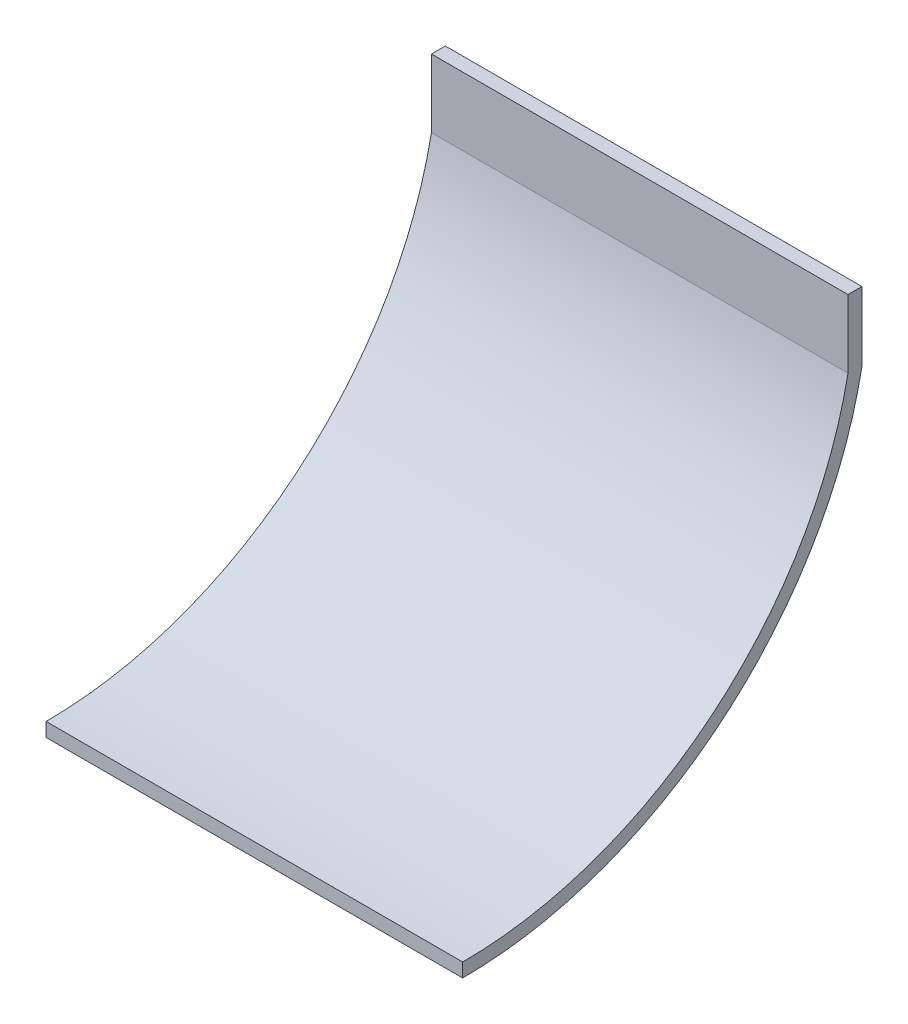
ISO-10303-21;
HEADER;
FILE_DESCRIPTION(('STEP AP214'),'2;1');
FILE_NAME('part.step','',(''),(''),'','','');
FILE_SCHEMA(('AUTOMOTIVE_DESIGN { 1 0 10303 214 1 1 1 1 }'));
ENDSEC;
DATA;
#1=APPLICATION_CONTEXT('core data for automotive mechanical design processes');
#2=APPLICATION_PROTOCOL_DEFINITION('international standard','automotive_design',2000,#1);
#3=PRODUCT_CONTEXT('',#1,'mechanical');
#4=PRODUCT('Part','Part','',(#3));
#5=PRODUCT_RELATED_PRODUCT_CATEGORY('part','',(#4));
#6=PRODUCT_DEFINITION_FORMATION('','',#4);
#7=PRODUCT_DEFINITION_CONTEXT('part definition',#1,'design');
#8=PRODUCT_DEFINITION('design','',#6,#7);
#9=PRODUCT_DEFINITION_SHAPE('','',#8);
#10=(LENGTH_UNIT() NAMED_UNIT(*) SI_UNIT(.MILLI.,.METRE.));
#11=(NAMED_UNIT(*) PLANE_ANGLE_UNIT() SI_UNIT($,.RADIAN.));
#12=(NAMED_UNIT(*) SI_UNIT($,.STERADIAN.) SOLID_ANGLE_UNIT());
#13=UNCERTAINTY_MEASURE_WITH_UNIT(LENGTH_MEASURE(1.E-05),#10,'distance_accuracy_value','');
#14=(GEOMETRIC_REPRESENTATION_CONTEXT(3) GLOBAL_UNCERTAINTY_ASSIGNED_CONTEXT((#13)) GLOBAL_UNIT_ASSIGNED_CONTEXT((#10,
#11,#12)) REPRESENTATION_CONTEXT('',''));
#15=CARTESIAN_POINT('',(0.,0.,0.));
#16=DIRECTION('',(0.,0.,1.));
#17=DIRECTION('',(1.,0.,0.));
#18=AXIS2_PLACEMENT_3D('',#15,#16,#17);
#19=CARTESIAN_POINT('',(-38.1,45.786842105263,38.0999999999998));
#20=DIRECTION('',(1.,0.,0.));
#21=DIRECTION('',(0.,0.,-1.));
#22=AXIS2_PLACEMENT_3D('',#19,#20,#21);
#23=CYLINDRICAL_SURFACE('',#22,74.361842105263);
#24=DIRECTION('',(1.,0.,0.));
#25=VECTOR('',#24,1.);
#26=CARTESIAN_POINT('',(-38.1,31.75,-34.925));
#27=LINE('',#26,#25);
#28=CARTESIAN_POINT('',(-38.1,31.75,-34.925));
#29=VERTEX_POINT('',#28);
#30=CARTESIAN_POINT('',(38.1,31.75,-34.925));
#31=VERTEX_POINT('',#30);
#32=EDGE_CURVE('E42',#29,#31,#27,.T.);
#33=ORIENTED_EDGE('',*,*,#32,.T.);
#34=CARTESIAN_POINT('',(38.1,45.786842105263,38.0999999999998));
#35=DIRECTION('',(1.,0.,0.));
#36=DIRECTION('',(0.,0.,-1.));
#37=AXIS2_PLACEMENT_3D('',#34,#35,#36);
#38=CIRCLE('',#37,74.361842105263);
#39=CARTESIAN_POINT('',(38.1,-28.575,38.1));
#40=VERTEX_POINT('',#39);
#41=EDGE_CURVE('E92',#40,#31,#38,.T.);
#42=ORIENTED_EDGE('',*,*,#41,.F.);
#43=DIRECTION('',(1.,0.,0.));
#44=VECTOR('',#43,1.);
#45=CARTESIAN_POINT('',(-38.1,-28.575,38.1));
#46=LINE('',#45,#44);
#47=CARTESIAN_POINT('',(-38.1,-28.575,38.1));
#48=VERTEX_POINT('',#47);
#49=EDGE_CURVE('E11',#48,#40,#46,.T.);
#50=ORIENTED_EDGE('',*,*,#49,.F.);
#51=CARTESIAN_POINT('',(-38.1,45.786842105263,38.0999999999998));
#52=DIRECTION('',(1.,0.,0.));
#53=DIRECTION('',(0.,0.,-1.));
#54=AXIS2_PLACEMENT_3D('',#51,#52,#53);
#55=CIRCLE('',#54,74.361842105263);
#56=EDGE_CURVE('E93',#48,#29,#55,.T.);
#57=ORIENTED_EDGE('',*,*,#56,.T.);
#58=EDGE_LOOP('',(#33,#42,#50,#57));
#59=FACE_BOUND('',#58,.T.);
#60=ADVANCED_FACE('F39',(#59),#23,.T.);
#61=CARTESIAN_POINT('',(-38.1,-26.035,38.1));
#62=DIRECTION('',(0.,0.,1.));
#63=DIRECTION('',(1.,0.,0.));
#64=AXIS2_PLACEMENT_3D('',#61,#62,#63);
#65=PLANE('',#64);
#66=ORIENTED_EDGE('',*,*,#49,.T.);
#67=DIRECTION('',(0.,-1.,0.));
#68=VECTOR('',#67,1.);
#69=CARTESIAN_POINT('',(38.1,-26.035,38.1));
#70=LINE('',#69,#68);
#71=CARTESIAN_POINT('',(38.1,-26.035,38.1));
#72=VERTEX_POINT('',#71);
#73=EDGE_CURVE('E112',#72,#40,#70,.T.);
#74=ORIENTED_EDGE('',*,*,#73,.F.);
#75=DIRECTION('',(1.,0.,0.));
#76=VECTOR('',#75,1.);
#77=CARTESIAN_POINT('',(-38.1,-26.035,38.1));
#78=LINE('',#77,#76);
#79=CARTESIAN_POINT('',(-38.1,-26.035,38.1));
#80=VERTEX_POINT('',#79);
#81=EDGE_CURVE('E48',#80,#72,#78,.T.);
#82=ORIENTED_EDGE('',*,*,#81,.F.);
#83=DIRECTION('',(0.,-1.,0.));
#84=VECTOR('',#83,1.);
#85=CARTESIAN_POINT('',(-38.1,-26.035,38.1));
#86=LINE('',#85,#84);
#87=EDGE_CURVE('E99',#80,#48,#86,.T.);
#88=ORIENTED_EDGE('',*,*,#87,.T.);
#89=EDGE_LOOP('',(#66,#74,#82,#88));
#90=FACE_BOUND('',#89,.T.);
#91=ADVANCED_FACE('F167',(#90),#65,.T.);
#92=CARTESIAN_POINT('',(-38.1,45.786842105263,38.0999999999998));
#93=DIRECTION('',(1.,0.,0.));
#94=DIRECTION('',(0.,0.,-1.));
#95=AXIS2_PLACEMENT_3D('',#92,#93,#94);
#96=CYLINDRICAL_SURFACE('',#95,71.821842105263);
#97=ORIENTED_EDGE('',*,*,#81,.T.);
#98=CARTESIAN_POINT('',(38.1,45.786842105263,38.0999999999998));
#99=DIRECTION('',(-1.,0.,0.));
#100=DIRECTION('',(0.,0.,-1.));
#101=AXIS2_PLACEMENT_3D('',#98,#99,#100);
#102=CIRCLE('',#101,71.821842105263);
#103=CARTESIAN_POINT('',(38.1,31.9940259173575,-32.385));
#104=VERTEX_POINT('',#103);
#105=EDGE_CURVE('E122',#104,#72,#102,.T.);
#106=ORIENTED_EDGE('',*,*,#105,.F.);
#107=DIRECTION('',(1.,0.,0.));
#108=VECTOR('',#107,1.);
#109=CARTESIAN_POINT('',(-38.1,31.9940259173575,-32.385));
#110=LINE('',#109,#108);
#111=CARTESIAN_POINT('',(-38.1,31.9940259173575,-32.385));
#112=VERTEX_POINT('',#111);
#113=EDGE_CURVE('E147',#112,#104,#110,.T.);
#114=ORIENTED_EDGE('',*,*,#113,.F.);
#115=CARTESIAN_POINT('',(-38.1,45.786842105263,38.0999999999998));
#116=DIRECTION('',(-1.,0.,0.));
#117=DIRECTION('',(0.,0.,-1.));
#118=AXIS2_PLACEMENT_3D('',#115,#116,#117);
#119=CIRCLE('',#118,71.821842105263);
#120=EDGE_CURVE('E140',#112,#80,#119,.T.);
#121=ORIENTED_EDGE('',*,*,#120,.T.);
#122=EDGE_LOOP('',(#97,#106,#114,#121));
#123=FACE_BOUND('',#122,.T.);
#124=ADVANCED_FACE('F163',(#123),#96,.F.);
#125=CARTESIAN_POINT('',(-38.1,31.9940259173575,-32.385));
#126=DIRECTION('',(0.,0.,1.));
#127=DIRECTION('',(1.,0.,0.));
#128=AXIS2_PLACEMENT_3D('',#125,#126,#127);
#129=PLANE('',#128);
#130=ORIENTED_EDGE('',*,*,#113,.T.);
#131=DIRECTION('',(0.,-1.,0.));
#132=VECTOR('',#131,1.);
#133=CARTESIAN_POINT('',(38.1,31.9940259173575,-32.385));
#134=LINE('',#133,#132);
#135=CARTESIAN_POINT('',(38.1,44.45,-32.385));
#136=VERTEX_POINT('',#135);
#137=EDGE_CURVE('E118',#136,#104,#134,.T.);
#138=ORIENTED_EDGE('',*,*,#137,.F.);
#139=DIRECTION('',(1.,0.,0.));
#140=VECTOR('',#139,1.);
#141=CARTESIAN_POINT('',(-38.1,44.45,-32.385));
#142=LINE('',#141,#140);
#143=CARTESIAN_POINT('',(-38.1,44.45,-32.385));
#144=VERTEX_POINT('',#143);
#145=EDGE_CURVE('E150',#144,#136,#142,.T.);
#146=ORIENTED_EDGE('',*,*,#145,.F.);
#147=DIRECTION('',(0.,-1.,0.));
#148=VECTOR('',#147,1.);
#149=CARTESIAN_POINT('',(-38.1,31.9940259173575,-32.385));
#150=LINE('',#149,#148);
#151=EDGE_CURVE('E136',#144,#112,#150,.T.);
#152=ORIENTED_EDGE('',*,*,#151,.T.);
#153=EDGE_LOOP('',(#130,#138,#146,#152));
#154=FACE_BOUND('',#153,.T.);
#155=ADVANCED_FACE('F160',(#154),#129,.T.);
#156=CARTESIAN_POINT('',(-38.1,44.45,-34.925));
#157=DIRECTION('',(0.,1.,0.));
#158=DIRECTION('',(0.,0.,1.));
#159=AXIS2_PLACEMENT_3D('',#156,#157,#158);
#160=PLANE('',#159);
#161=ORIENTED_EDGE('',*,*,#145,.T.);
#162=DIRECTION('',(0.,0.,1.));
#163=VECTOR('',#162,1.);
#164=CARTESIAN_POINT('',(38.1,44.45,-34.925));
#165=LINE('',#164,#163);
#166=CARTESIAN_POINT('',(38.1,44.45,-34.925));
#167=VERTEX_POINT('',#166);
#168=EDGE_CURVE('E107',#167,#136,#165,.T.);
#169=ORIENTED_EDGE('',*,*,#168,.F.);
#170=DIRECTION('',(1.,0.,0.));
#171=VECTOR('',#170,1.);
#172=CARTESIAN_POINT('',(-38.1,44.45,-34.925));
#173=LINE('',#172,#171);
#174=CARTESIAN_POINT('',(-38.1,44.45,-34.925));
#175=VERTEX_POINT('',#174);
#176=EDGE_CURVE('E98',#175,#167,#173,.T.);
#177=ORIENTED_EDGE('',*,*,#176,.F.);
#178=DIRECTION('',(0.,0.,1.));
#179=VECTOR('',#178,1.);
#180=CARTESIAN_POINT('',(-38.1,44.45,-34.925));
#181=LINE('',#180,#179);
#182=EDGE_CURVE('E132',#175,#144,#181,.T.);
#183=ORIENTED_EDGE('',*,*,#182,.T.);
#184=EDGE_LOOP('',(#161,#169,#177,#183));
#185=FACE_BOUND('',#184,.T.);
#186=ADVANCED_FACE('F154',(#185),#160,.T.);
#187=CARTESIAN_POINT('',(-38.1,31.75,-34.925));
#188=DIRECTION('',(0.,0.,-1.));
#189=DIRECTION('',(-1.,0.,0.));
#190=AXIS2_PLACEMENT_3D('',#187,#188,#189);
#191=PLANE('',#190);
#192=ORIENTED_EDGE('',*,*,#176,.T.);
#193=DIRECTION('',(0.,1.,0.));
#194=VECTOR('',#193,1.);
#195=CARTESIAN_POINT('',(38.1,31.75,-34.925));
#196=LINE('',#195,#194);
#197=EDGE_CURVE('E101',#31,#167,#196,.T.);
#198=ORIENTED_EDGE('',*,*,#197,.F.);
#199=ORIENTED_EDGE('',*,*,#32,.F.);
#200=DIRECTION('',(0.,1.,0.));
#201=VECTOR('',#200,1.);
#202=CARTESIAN_POINT('',(-38.1,31.75,-34.925));
#203=LINE('',#202,#201);
#204=EDGE_CURVE('E129',#29,#175,#203,.T.);
#205=ORIENTED_EDGE('',*,*,#204,.T.);
#206=EDGE_LOOP('',(#192,#198,#199,#205));
#207=FACE_BOUND('',#206,.T.);
#208=ADVANCED_FACE('F102',(#207),#191,.T.);
#209=CARTESIAN_POINT('',(-38.1,45.786842105263,38.0999999999998));
#210=DIRECTION('',(1.,0.,0.));
#211=DIRECTION('',(0.,0.,-1.));
#212=AXIS2_PLACEMENT_3D('',#209,#210,#211);
#213=PLANE('',#212);
#214=ORIENTED_EDGE('',*,*,#56,.F.);
#215=ORIENTED_EDGE('',*,*,#87,.F.);
#216=ORIENTED_EDGE('',*,*,#120,.F.);
#217=ORIENTED_EDGE('',*,*,#151,.F.);
#218=ORIENTED_EDGE('',*,*,#182,.F.);
#219=ORIENTED_EDGE('',*,*,#204,.F.);
#220=EDGE_LOOP('',(#214,#215,#216,#217,#218,#219));
#221=FACE_BOUND('',#220,.T.);
#222=ADVANCED_FACE('F166',(#221),#213,.F.);
#223=CARTESIAN_POINT('',(38.1,45.786842105263,38.0999999999998));
#224=DIRECTION('',(1.,0.,0.));
#225=DIRECTION('',(0.,0.,-1.));
#226=AXIS2_PLACEMENT_3D('',#223,#224,#225);
#227=PLANE('',#226);
#228=ORIENTED_EDGE('',*,*,#41,.T.);
#229=ORIENTED_EDGE('',*,*,#197,.T.);
#230=ORIENTED_EDGE('',*,*,#168,.T.);
#231=ORIENTED_EDGE('',*,*,#137,.T.);
#232=ORIENTED_EDGE('',*,*,#105,.T.);
#233=ORIENTED_EDGE('',*,*,#73,.T.);
#234=EDGE_LOOP('',(#228,#229,#230,#231,#232,#233));
#235=FACE_BOUND('',#234,.T.);
#236=ADVANCED_FACE('F110',(#235),#227,.T.);
#237=CLOSED_SHELL('',(#60,#91,#124,#155,#186,#208,#222,#236));
#238=MANIFOLD_SOLID_BREP('B2',#237);
#239=ADVANCED_BREP_SHAPE_REPRESENTATION('',(#18,#238),#14);
#240=SHAPE_DEFINITION_REPRESENTATION(#9,#239);
ENDSEC;
END-ISO-10303-21;
